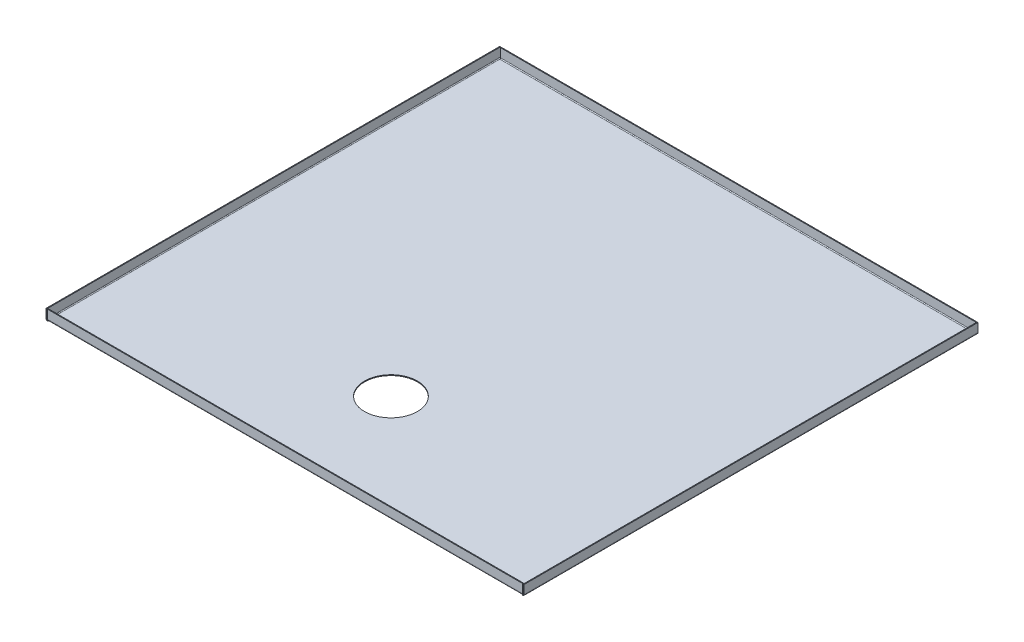
ISO-10303-21;
HEADER;
FILE_DESCRIPTION(('STEP AP214'),'2;1');
FILE_NAME('part.step','',(''),(''),'','','');
FILE_SCHEMA(('AUTOMOTIVE_DESIGN { 1 0 10303 214 1 1 1 1 }'));
ENDSEC;
DATA;
#1=APPLICATION_CONTEXT('core data for automotive mechanical design processes');
#2=APPLICATION_PROTOCOL_DEFINITION('international standard','automotive_design',2000,#1);
#3=PRODUCT_CONTEXT('',#1,'mechanical');
#4=PRODUCT('Part','Part','',(#3));
#5=PRODUCT_RELATED_PRODUCT_CATEGORY('part','',(#4));
#6=PRODUCT_DEFINITION_FORMATION('','',#4);
#7=PRODUCT_DEFINITION_CONTEXT('part definition',#1,'design');
#8=PRODUCT_DEFINITION('design','',#6,#7);
#9=PRODUCT_DEFINITION_SHAPE('','',#8);
#10=(LENGTH_UNIT() NAMED_UNIT(*) SI_UNIT(.MILLI.,.METRE.));
#11=(NAMED_UNIT(*) PLANE_ANGLE_UNIT() SI_UNIT($,.RADIAN.));
#12=(NAMED_UNIT(*) SI_UNIT($,.STERADIAN.) SOLID_ANGLE_UNIT());
#13=UNCERTAINTY_MEASURE_WITH_UNIT(LENGTH_MEASURE(1.E-05),#10,'distance_accuracy_value','');
#14=(GEOMETRIC_REPRESENTATION_CONTEXT(3) GLOBAL_UNCERTAINTY_ASSIGNED_CONTEXT((#13)) GLOBAL_UNIT_ASSIGNED_CONTEXT((#10,
#11,#12)) REPRESENTATION_CONTEXT('',''));
#15=CARTESIAN_POINT('',(0.,0.,0.));
#16=DIRECTION('',(0.,0.,1.));
#17=DIRECTION('',(1.,0.,0.));
#18=AXIS2_PLACEMENT_3D('',#15,#16,#17);
#19=CARTESIAN_POINT('',(4.,2.,0.));
#20=DIRECTION('',(1.,0.,0.));
#21=DIRECTION('',(0.,0.,-1.));
#22=AXIS2_PLACEMENT_3D('',#19,#20,#21);
#23=PLANE('',#22);
#24=DIRECTION('',(0.,0.,1.));
#25=VECTOR('',#24,1.);
#26=CARTESIAN_POINT('',(4.,2.,0.));
#27=LINE('',#26,#25);
#28=CARTESIAN_POINT('',(4.,2.,0.));
#29=VERTEX_POINT('',#28);
#30=CARTESIAN_POINT('',(4.,2.,0.535898384862228));
#31=VERTEX_POINT('',#30);
#32=EDGE_CURVE('E204',#29,#31,#27,.T.);
#33=ORIENTED_EDGE('',*,*,#32,.T.);
#34=CARTESIAN_POINT('',(4.,3.99999999999998,3.99999999999999));
#35=DIRECTION('',(-1.,0.,0.));
#36=DIRECTION('',(0.,0.,1.));
#37=AXIS2_PLACEMENT_3D('',#34,#35,#36);
#38=CIRCLE('',#37,4.);
#39=CARTESIAN_POINT('',(4.,0.,4.));
#40=VERTEX_POINT('',#39);
#41=EDGE_CURVE('E13',#31,#40,#38,.T.);
#42=ORIENTED_EDGE('',*,*,#41,.T.);
#43=DIRECTION('',(0.,0.,-1.));
#44=VECTOR('',#43,1.);
#45=CARTESIAN_POINT('',(4.,0.,1096.));
#46=LINE('',#45,#44);
#47=CARTESIAN_POINT('',(4.,0.,0.));
#48=VERTEX_POINT('',#47);
#49=EDGE_CURVE('E232',#40,#48,#46,.T.);
#50=ORIENTED_EDGE('',*,*,#49,.T.);
#51=DIRECTION('',(0.,1.,0.));
#52=VECTOR('',#51,1.);
#53=CARTESIAN_POINT('',(4.,0.,0.));
#54=LINE('',#53,#52);
#55=EDGE_CURVE('E269',#48,#29,#54,.T.);
#56=ORIENTED_EDGE('',*,*,#55,.T.);
#57=EDGE_LOOP('',(#33,#42,#50,#56));
#58=FACE_BOUND('',#57,.T.);
#59=ADVANCED_FACE('F76',(#58),#23,.T.);
#60=CARTESIAN_POINT('',(1151.,1.99999999999998,3.99999999999999));
#61=DIRECTION('',(-1.,0.,0.));
#62=DIRECTION('',(0.,0.,1.));
#63=AXIS2_PLACEMENT_3D('',#60,#61,#62);
#64=PLANE('',#63);
#65=DIRECTION('',(0.,0.,-1.));
#66=VECTOR('',#65,1.);
#67=CARTESIAN_POINT('',(1151.,0.,1096.));
#68=LINE('',#67,#66);
#69=CARTESIAN_POINT('',(1151.,0.,3.99999999999999));
#70=VERTEX_POINT('',#69);
#71=CARTESIAN_POINT('',(1151.,0.,0.));
#72=VERTEX_POINT('',#71);
#73=EDGE_CURVE('E228',#70,#72,#68,.T.);
#74=ORIENTED_EDGE('',*,*,#73,.F.);
#75=CARTESIAN_POINT('',(1151.,3.99999999999998,3.99999999999999));
#76=DIRECTION('',(-1.,0.,0.));
#77=DIRECTION('',(0.,0.,1.));
#78=AXIS2_PLACEMENT_3D('',#75,#76,#77);
#79=CIRCLE('',#78,4.);
#80=CARTESIAN_POINT('',(1151.,2.,0.535898384862228));
#81=VERTEX_POINT('',#80);
#82=EDGE_CURVE('E401',#70,#81,#79,.F.);
#83=ORIENTED_EDGE('',*,*,#82,.T.);
#84=DIRECTION('',(0.,0.,-1.));
#85=VECTOR('',#84,1.);
#86=CARTESIAN_POINT('',(1151.,1.99999999999998,3.99999999999999));
#87=LINE('',#86,#85);
#88=CARTESIAN_POINT('',(1151.,2.,0.));
#89=VERTEX_POINT('',#88);
#90=EDGE_CURVE('E316',#81,#89,#87,.T.);
#91=ORIENTED_EDGE('',*,*,#90,.T.);
#92=DIRECTION('',(0.,-1.,0.));
#93=VECTOR('',#92,1.);
#94=CARTESIAN_POINT('',(1151.,2.,0.));
#95=LINE('',#94,#93);
#96=EDGE_CURVE('E260',#89,#72,#95,.T.);
#97=ORIENTED_EDGE('',*,*,#96,.T.);
#98=EDGE_LOOP('',(#74,#83,#91,#97));
#99=FACE_BOUND('',#98,.T.);
#100=ADVANCED_FACE('F597',(#99),#64,.T.);
#101=CARTESIAN_POINT('',(1151.,2.,1096.));
#102=DIRECTION('',(-1.,0.,0.));
#103=DIRECTION('',(0.,0.,1.));
#104=AXIS2_PLACEMENT_3D('',#101,#102,#103);
#105=PLANE('',#104);
#106=DIRECTION('',(0.,0.,-1.));
#107=VECTOR('',#106,1.);
#108=CARTESIAN_POINT('',(1151.,2.,1096.));
#109=LINE('',#108,#107);
#110=CARTESIAN_POINT('',(1151.,2.,1096.));
#111=VERTEX_POINT('',#110);
#112=CARTESIAN_POINT('',(1151.,2.,1095.46410161514));
#113=VERTEX_POINT('',#112);
#114=EDGE_CURVE('E249',#111,#113,#109,.T.);
#115=ORIENTED_EDGE('',*,*,#114,.T.);
#116=CARTESIAN_POINT('',(1151.,4.,1092.));
#117=DIRECTION('',(1.,0.,0.));
#118=DIRECTION('',(0.,0.,-1.));
#119=AXIS2_PLACEMENT_3D('',#116,#117,#118);
#120=CIRCLE('',#119,4.);
#121=CARTESIAN_POINT('',(1151.,0.,1092.));
#122=VERTEX_POINT('',#121);
#123=EDGE_CURVE('E85',#113,#122,#120,.T.);
#124=ORIENTED_EDGE('',*,*,#123,.T.);
#125=CARTESIAN_POINT('',(1151.,0.,1096.));
#126=VERTEX_POINT('',#125);
#127=EDGE_CURVE('E229',#126,#122,#68,.T.);
#128=ORIENTED_EDGE('',*,*,#127,.F.);
#129=DIRECTION('',(0.,1.,0.));
#130=VECTOR('',#129,1.);
#131=CARTESIAN_POINT('',(1151.,0.,1096.));
#132=LINE('',#131,#130);
#133=EDGE_CURVE('E264',#126,#111,#132,.T.);
#134=ORIENTED_EDGE('',*,*,#133,.T.);
#135=EDGE_LOOP('',(#115,#124,#128,#134));
#136=FACE_BOUND('',#135,.T.);
#137=ADVANCED_FACE('F602',(#136),#105,.T.);
#138=CARTESIAN_POINT('',(4.,2.,1092.));
#139=DIRECTION('',(1.,0.,0.));
#140=DIRECTION('',(0.,0.,-1.));
#141=AXIS2_PLACEMENT_3D('',#138,#139,#140);
#142=PLANE('',#141);
#143=CARTESIAN_POINT('',(4.,0.,1096.));
#144=VERTEX_POINT('',#143);
#145=CARTESIAN_POINT('',(4.,0.,1092.));
#146=VERTEX_POINT('',#145);
#147=EDGE_CURVE('E234',#144,#146,#46,.T.);
#148=ORIENTED_EDGE('',*,*,#147,.T.);
#149=CARTESIAN_POINT('',(4.,4.,1092.));
#150=DIRECTION('',(1.,0.,0.));
#151=DIRECTION('',(0.,0.,-1.));
#152=AXIS2_PLACEMENT_3D('',#149,#150,#151);
#153=CIRCLE('',#152,4.);
#154=CARTESIAN_POINT('',(4.,2.,1095.46410161514));
#155=VERTEX_POINT('',#154);
#156=EDGE_CURVE('E452',#146,#155,#153,.F.);
#157=ORIENTED_EDGE('',*,*,#156,.T.);
#158=DIRECTION('',(0.,0.,-1.));
#159=VECTOR('',#158,1.);
#160=CARTESIAN_POINT('',(4.,2.,1096.));
#161=LINE('',#160,#159);
#162=CARTESIAN_POINT('',(4.,2.,1096.));
#163=VERTEX_POINT('',#162);
#164=EDGE_CURVE('E244',#163,#155,#161,.T.);
#165=ORIENTED_EDGE('',*,*,#164,.F.);
#166=DIRECTION('',(0.,-1.,0.));
#167=VECTOR('',#166,1.);
#168=CARTESIAN_POINT('',(4.,2.,1096.));
#169=LINE('',#168,#167);
#170=EDGE_CURVE('E272',#163,#144,#169,.T.);
#171=ORIENTED_EDGE('',*,*,#170,.T.);
#172=EDGE_LOOP('',(#148,#157,#165,#171));
#173=FACE_BOUND('',#172,.T.);
#174=ADVANCED_FACE('F380',(#173),#142,.T.);
#175=CARTESIAN_POINT('',(0.,2.,1096.));
#176=DIRECTION('',(0.,1.,0.));
#177=DIRECTION('',(0.,0.,1.));
#178=AXIS2_PLACEMENT_3D('',#175,#176,#177);
#179=PLANE('',#178);
#180=CARTESIAN_POINT('',(577.499999999998,2.,840.335133884615));
#181=DIRECTION('',(0.,1.,0.));
#182=DIRECTION('',(0.,0.,1.));
#183=AXIS2_PLACEMENT_3D('',#180,#181,#182);
#184=CIRCLE('',#183,63.9208880454919);
#185=CARTESIAN_POINT('',(577.499999999998,2.,904.256021930107));
#186=VERTEX_POINT('',#185);
#187=EDGE_CURVE('E573',#186,#186,#184,.T.);
#188=ORIENTED_EDGE('',*,*,#187,.F.);
#189=EDGE_LOOP('',(#188));
#190=FACE_BOUND('',#189,.T.);
#191=CARTESIAN_POINT('',(1151.,2.,1092.));
#192=VERTEX_POINT('',#191);
#193=CARTESIAN_POINT('',(1151.,1.99999999999998,3.99999999999999));
#194=VERTEX_POINT('',#193);
#195=EDGE_CURVE('E247',#192,#194,#109,.T.);
#196=ORIENTED_EDGE('',*,*,#195,.T.);
#197=DIRECTION('',(-1.,0.,0.));
#198=VECTOR('',#197,1.);
#199=CARTESIAN_POINT('',(4.,1.99999999999998,3.99999999999999));
#200=LINE('',#199,#198);
#201=CARTESIAN_POINT('',(4.,1.99999999999998,3.99999999999999));
#202=VERTEX_POINT('',#201);
#203=EDGE_CURVE('E414',#202,#194,#200,.F.);
#204=ORIENTED_EDGE('',*,*,#203,.F.);
#205=CARTESIAN_POINT('',(4.,2.,1092.));
#206=VERTEX_POINT('',#205);
#207=EDGE_CURVE('E243',#206,#202,#161,.T.);
#208=ORIENTED_EDGE('',*,*,#207,.F.);
#209=DIRECTION('',(1.,0.,0.));
#210=VECTOR('',#209,1.);
#211=CARTESIAN_POINT('',(1151.,2.,1092.));
#212=LINE('',#211,#210);
#213=EDGE_CURVE('E299',#192,#206,#212,.F.);
#214=ORIENTED_EDGE('',*,*,#213,.F.);
#215=EDGE_LOOP('',(#196,#204,#208,#214));
#216=FACE_BOUND('',#215,.T.);
#217=ADVANCED_FACE('F609',(#190,#216),#179,.T.);
#218=CARTESIAN_POINT('',(0.,0.,1096.));
#219=DIRECTION('',(0.,1.,0.));
#220=DIRECTION('',(0.,0.,1.));
#221=AXIS2_PLACEMENT_3D('',#218,#219,#220);
#222=PLANE('',#221);
#223=CARTESIAN_POINT('',(577.499999999998,0.,840.335133884615));
#224=DIRECTION('',(0.,1.,0.));
#225=DIRECTION('',(0.,0.,1.));
#226=AXIS2_PLACEMENT_3D('',#223,#224,#225);
#227=CIRCLE('',#226,63.9208880454919);
#228=CARTESIAN_POINT('',(577.499999999998,0.,904.256021930107));
#229=VERTEX_POINT('',#228);
#230=EDGE_CURVE('E80',#229,#229,#227,.T.);
#231=ORIENTED_EDGE('',*,*,#230,.T.);
#232=EDGE_LOOP('',(#231));
#233=FACE_BOUND('',#232,.T.);
#234=DIRECTION('',(-1.,0.,0.));
#235=VECTOR('',#234,1.);
#236=CARTESIAN_POINT('',(4.,0.,3.99999999999999));
#237=LINE('',#236,#235);
#238=EDGE_CURVE('E391',#40,#70,#237,.F.);
#239=ORIENTED_EDGE('',*,*,#238,.T.);
#240=EDGE_CURVE('E233',#122,#70,#68,.T.);
#241=ORIENTED_EDGE('',*,*,#240,.F.);
#242=DIRECTION('',(1.,0.,0.));
#243=VECTOR('',#242,1.);
#244=CARTESIAN_POINT('',(1151.,0.,1092.));
#245=LINE('',#244,#243);
#246=EDGE_CURVE('E287',#122,#146,#245,.F.);
#247=ORIENTED_EDGE('',*,*,#246,.T.);
#248=EDGE_CURVE('E237',#146,#40,#46,.T.);
#249=ORIENTED_EDGE('',*,*,#248,.T.);
#250=EDGE_LOOP('',(#239,#241,#247,#249));
#251=FACE_BOUND('',#250,.T.);
#252=ADVANCED_FACE('F390',(#233,#251),#222,.F.);
#253=CARTESIAN_POINT('',(0.,4.,1096.));
#254=DIRECTION('',(0.,0.,1.));
#255=DIRECTION('',(1.,0.,0.));
#256=AXIS2_PLACEMENT_3D('',#253,#254,#255);
#257=PLANE('',#256);
#258=DIRECTION('',(1.,0.,0.));
#259=VECTOR('',#258,1.);
#260=CARTESIAN_POINT('',(0.,4.,1096.));
#261=LINE('',#260,#259);
#262=CARTESIAN_POINT('',(0.,4.,1096.));
#263=VERTEX_POINT('',#262);
#264=CARTESIAN_POINT('',(2.,4.,1096.));
#265=VERTEX_POINT('',#264);
#266=EDGE_CURVE('E274',#263,#265,#261,.T.);
#267=ORIENTED_EDGE('',*,*,#266,.F.);
#268=CARTESIAN_POINT('',(4.,4.,1096.));
#269=DIRECTION('',(0.,0.,-1.));
#270=DIRECTION('',(-1.,0.,0.));
#271=AXIS2_PLACEMENT_3D('',#268,#269,#270);
#272=CIRCLE('',#271,4.);
#273=EDGE_CURVE('E184',#263,#144,#272,.F.);
#274=ORIENTED_EDGE('',*,*,#273,.T.);
#275=ORIENTED_EDGE('',*,*,#170,.F.);
#276=CARTESIAN_POINT('',(4.,4.,1096.));
#277=DIRECTION('',(0.,0.,1.));
#278=DIRECTION('',(1.,0.,0.));
#279=AXIS2_PLACEMENT_3D('',#276,#277,#278);
#280=CIRCLE('',#279,2.);
#281=EDGE_CURVE('E191',#265,#163,#280,.T.);
#282=ORIENTED_EDGE('',*,*,#281,.F.);
#283=EDGE_LOOP('',(#267,#274,#275,#282));
#284=FACE_BOUND('',#283,.T.);
#285=ADVANCED_FACE('F78',(#284),#257,.T.);
#286=CARTESIAN_POINT('',(4.,2.,1096.));
#287=DIRECTION('',(0.,0.,1.));
#288=DIRECTION('',(1.,0.,0.));
#289=AXIS2_PLACEMENT_3D('',#286,#287,#288);
#290=PLANE('',#289);
#291=DIRECTION('',(0.,-1.,0.));
#292=VECTOR('',#291,1.);
#293=CARTESIAN_POINT('',(0.,25.,1096.));
#294=LINE('',#293,#292);
#295=CARTESIAN_POINT('',(0.,25.,1096.));
#296=VERTEX_POINT('',#295);
#297=EDGE_CURVE('E179',#296,#263,#294,.T.);
#298=ORIENTED_EDGE('',*,*,#297,.T.);
#299=ORIENTED_EDGE('',*,*,#266,.T.);
#300=DIRECTION('',(0.,-1.,0.));
#301=VECTOR('',#300,1.);
#302=CARTESIAN_POINT('',(2.00000000000001,25.,1096.));
#303=LINE('',#302,#301);
#304=CARTESIAN_POINT('',(2.00000000000001,25.,1096.));
#305=VERTEX_POINT('',#304);
#306=EDGE_CURVE('E189',#305,#265,#303,.T.);
#307=ORIENTED_EDGE('',*,*,#306,.F.);
#308=DIRECTION('',(1.,0.,0.));
#309=VECTOR('',#308,1.);
#310=CARTESIAN_POINT('',(0.,25.,1096.));
#311=LINE('',#310,#309);
#312=EDGE_CURVE('E168',#296,#305,#311,.T.);
#313=ORIENTED_EDGE('',*,*,#312,.F.);
#314=EDGE_LOOP('',(#298,#299,#307,#313));
#315=FACE_BOUND('',#314,.T.);
#316=ADVANCED_FACE('F187',(#315),#290,.T.);
#317=CARTESIAN_POINT('',(4.,0.,0.));
#318=DIRECTION('',(0.,0.,-1.));
#319=DIRECTION('',(-1.,0.,0.));
#320=AXIS2_PLACEMENT_3D('',#317,#318,#319);
#321=PLANE('',#320);
#322=ORIENTED_EDGE('',*,*,#55,.F.);
#323=CARTESIAN_POINT('',(4.,4.,0.));
#324=DIRECTION('',(0.,0.,-1.));
#325=DIRECTION('',(-1.,0.,0.));
#326=AXIS2_PLACEMENT_3D('',#323,#324,#325);
#327=CIRCLE('',#326,4.);
#328=CARTESIAN_POINT('',(0.,4.,0.));
#329=VERTEX_POINT('',#328);
#330=EDGE_CURVE('E221',#329,#48,#327,.F.);
#331=ORIENTED_EDGE('',*,*,#330,.F.);
#332=DIRECTION('',(-1.,0.,0.));
#333=VECTOR('',#332,1.);
#334=CARTESIAN_POINT('',(2.,4.,0.));
#335=LINE('',#334,#333);
#336=CARTESIAN_POINT('',(2.,4.,0.));
#337=VERTEX_POINT('',#336);
#338=EDGE_CURVE('E267',#337,#329,#335,.T.);
#339=ORIENTED_EDGE('',*,*,#338,.F.);
#340=CARTESIAN_POINT('',(4.,4.,0.));
#341=DIRECTION('',(0.,0.,1.));
#342=DIRECTION('',(1.,0.,0.));
#343=AXIS2_PLACEMENT_3D('',#340,#341,#342);
#344=CIRCLE('',#343,2.);
#345=EDGE_CURVE('E212',#337,#29,#344,.T.);
#346=ORIENTED_EDGE('',*,*,#345,.T.);
#347=EDGE_LOOP('',(#322,#331,#339,#346));
#348=FACE_BOUND('',#347,.T.);
#349=ADVANCED_FACE('F352',(#348),#321,.T.);
#350=CARTESIAN_POINT('',(1151.,0.,1096.));
#351=DIRECTION('',(0.,0.,1.));
#352=DIRECTION('',(1.,0.,0.));
#353=AXIS2_PLACEMENT_3D('',#350,#351,#352);
#354=PLANE('',#353);
#355=ORIENTED_EDGE('',*,*,#133,.F.);
#356=CARTESIAN_POINT('',(1151.,4.,1096.));
#357=DIRECTION('',(0.,0.,-1.));
#358=DIRECTION('',(-1.,0.,0.));
#359=AXIS2_PLACEMENT_3D('',#356,#357,#358);
#360=CIRCLE('',#359,4.);
#361=CARTESIAN_POINT('',(1155.,4.,1096.));
#362=VERTEX_POINT('',#361);
#363=EDGE_CURVE('E197',#126,#362,#360,.F.);
#364=ORIENTED_EDGE('',*,*,#363,.T.);
#365=DIRECTION('',(1.,0.,0.));
#366=VECTOR('',#365,1.);
#367=CARTESIAN_POINT('',(1153.,4.,1096.));
#368=LINE('',#367,#366);
#369=CARTESIAN_POINT('',(1153.,4.,1096.));
#370=VERTEX_POINT('',#369);
#371=EDGE_CURVE('E103',#370,#362,#368,.T.);
#372=ORIENTED_EDGE('',*,*,#371,.F.);
#373=CARTESIAN_POINT('',(1151.,4.,1096.));
#374=DIRECTION('',(0.,0.,1.));
#375=DIRECTION('',(1.,0.,0.));
#376=AXIS2_PLACEMENT_3D('',#373,#374,#375);
#377=CIRCLE('',#376,2.);
#378=EDGE_CURVE('E324',#111,#370,#377,.T.);
#379=ORIENTED_EDGE('',*,*,#378,.F.);
#380=EDGE_LOOP('',(#355,#364,#372,#379));
#381=FACE_BOUND('',#380,.T.);
#382=ADVANCED_FACE('F659',(#381),#354,.T.);
#383=CARTESIAN_POINT('',(1155.,4.,0.));
#384=DIRECTION('',(0.,0.,-1.));
#385=DIRECTION('',(-1.,0.,0.));
#386=AXIS2_PLACEMENT_3D('',#383,#384,#385);
#387=PLANE('',#386);
#388=DIRECTION('',(-1.,0.,0.));
#389=VECTOR('',#388,1.);
#390=CARTESIAN_POINT('',(1155.,4.,0.));
#391=LINE('',#390,#389);
#392=CARTESIAN_POINT('',(1155.,4.,0.));
#393=VERTEX_POINT('',#392);
#394=CARTESIAN_POINT('',(1153.,4.,0.));
#395=VERTEX_POINT('',#394);
#396=EDGE_CURVE('E140',#393,#395,#391,.T.);
#397=ORIENTED_EDGE('',*,*,#396,.F.);
#398=CARTESIAN_POINT('',(1151.,4.,0.));
#399=DIRECTION('',(0.,0.,-1.));
#400=DIRECTION('',(-1.,0.,0.));
#401=AXIS2_PLACEMENT_3D('',#398,#399,#400);
#402=CIRCLE('',#401,4.);
#403=EDGE_CURVE('E224',#72,#393,#402,.F.);
#404=ORIENTED_EDGE('',*,*,#403,.F.);
#405=ORIENTED_EDGE('',*,*,#96,.F.);
#406=CARTESIAN_POINT('',(1151.,4.,0.));
#407=DIRECTION('',(0.,0.,1.));
#408=DIRECTION('',(1.,0.,0.));
#409=AXIS2_PLACEMENT_3D('',#406,#407,#408);
#410=CIRCLE('',#409,2.);
#411=EDGE_CURVE('E210',#89,#395,#410,.T.);
#412=ORIENTED_EDGE('',*,*,#411,.T.);
#413=EDGE_LOOP('',(#397,#404,#405,#412));
#414=FACE_BOUND('',#413,.T.);
#415=ADVANCED_FACE('F655',(#414),#387,.T.);
#416=CARTESIAN_POINT('',(1151.,2.,0.));
#417=DIRECTION('',(0.,0.,-1.));
#418=DIRECTION('',(-1.,0.,0.));
#419=AXIS2_PLACEMENT_3D('',#416,#417,#418);
#420=PLANE('',#419);
#421=DIRECTION('',(0.,1.,0.));
#422=VECTOR('',#421,1.);
#423=CARTESIAN_POINT('',(1155.,0.,0.));
#424=LINE('',#423,#422);
#425=CARTESIAN_POINT('',(1155.,25.,0.));
#426=VERTEX_POINT('',#425);
#427=EDGE_CURVE('E200',#393,#426,#424,.T.);
#428=ORIENTED_EDGE('',*,*,#427,.F.);
#429=ORIENTED_EDGE('',*,*,#396,.T.);
#430=DIRECTION('',(0.,1.,0.));
#431=VECTOR('',#430,1.);
#432=CARTESIAN_POINT('',(1153.,0.,0.));
#433=LINE('',#432,#431);
#434=CARTESIAN_POINT('',(1153.,25.,0.));
#435=VERTEX_POINT('',#434);
#436=EDGE_CURVE('E207',#395,#435,#433,.T.);
#437=ORIENTED_EDGE('',*,*,#436,.T.);
#438=DIRECTION('',(1.,0.,0.));
#439=VECTOR('',#438,1.);
#440=CARTESIAN_POINT('',(1153.,25.,0.));
#441=LINE('',#440,#439);
#442=EDGE_CURVE('E203',#435,#426,#441,.T.);
#443=ORIENTED_EDGE('',*,*,#442,.T.);
#444=EDGE_LOOP('',(#428,#429,#437,#443));
#445=FACE_BOUND('',#444,.T.);
#446=ADVANCED_FACE('F651',(#445),#420,.T.);
#447=CARTESIAN_POINT('',(1155.,0.,1096.));
#448=DIRECTION('',(-1.,0.,0.));
#449=DIRECTION('',(0.,0.,1.));
#450=AXIS2_PLACEMENT_3D('',#447,#448,#449);
#451=PLANE('',#450);
#452=ORIENTED_EDGE('',*,*,#427,.T.);
#453=DIRECTION('',(0.,0.,-1.));
#454=VECTOR('',#453,1.);
#455=CARTESIAN_POINT('',(1155.,25.,1096.));
#456=LINE('',#455,#454);
#457=CARTESIAN_POINT('',(1155.,25.,1096.));
#458=VERTEX_POINT('',#457);
#459=EDGE_CURVE('E258',#458,#426,#456,.T.);
#460=ORIENTED_EDGE('',*,*,#459,.F.);
#461=DIRECTION('',(0.,1.,0.));
#462=VECTOR('',#461,1.);
#463=CARTESIAN_POINT('',(1155.,0.,1096.));
#464=LINE('',#463,#462);
#465=EDGE_CURVE('E146',#362,#458,#464,.T.);
#466=ORIENTED_EDGE('',*,*,#465,.F.);
#467=DIRECTION('',(0.,0.,-1.));
#468=VECTOR('',#467,1.);
#469=CARTESIAN_POINT('',(1155.,4.,1096.));
#470=LINE('',#469,#468);
#471=EDGE_CURVE('E199',#362,#393,#470,.T.);
#472=ORIENTED_EDGE('',*,*,#471,.T.);
#473=EDGE_LOOP('',(#452,#460,#466,#472));
#474=FACE_BOUND('',#473,.T.);
#475=ADVANCED_FACE('F647',(#474),#451,.F.);
#476=CARTESIAN_POINT('',(1153.,25.,1096.));
#477=DIRECTION('',(0.,1.,0.));
#478=DIRECTION('',(0.,0.,1.));
#479=AXIS2_PLACEMENT_3D('',#476,#477,#478);
#480=PLANE('',#479);
#481=ORIENTED_EDGE('',*,*,#442,.F.);
#482=DIRECTION('',(0.,0.,-1.));
#483=VECTOR('',#482,1.);
#484=CARTESIAN_POINT('',(1153.,25.,1096.));
#485=LINE('',#484,#483);
#486=CARTESIAN_POINT('',(1153.,25.,1096.));
#487=VERTEX_POINT('',#486);
#488=EDGE_CURVE('E256',#487,#435,#485,.T.);
#489=ORIENTED_EDGE('',*,*,#488,.F.);
#490=DIRECTION('',(1.,0.,0.));
#491=VECTOR('',#490,1.);
#492=CARTESIAN_POINT('',(1153.,25.,1096.));
#493=LINE('',#492,#491);
#494=EDGE_CURVE('E318',#487,#458,#493,.T.);
#495=ORIENTED_EDGE('',*,*,#494,.T.);
#496=ORIENTED_EDGE('',*,*,#459,.T.);
#497=EDGE_LOOP('',(#481,#489,#495,#496));
#498=FACE_BOUND('',#497,.T.);
#499=ADVANCED_FACE('F643',(#498),#480,.T.);
#500=CARTESIAN_POINT('',(1153.,0.,1096.));
#501=DIRECTION('',(-1.,0.,0.));
#502=DIRECTION('',(0.,0.,1.));
#503=AXIS2_PLACEMENT_3D('',#500,#501,#502);
#504=PLANE('',#503);
#505=ORIENTED_EDGE('',*,*,#436,.F.);
#506=DIRECTION('',(0.,0.,-1.));
#507=VECTOR('',#506,1.);
#508=CARTESIAN_POINT('',(1153.,4.,1096.));
#509=LINE('',#508,#507);
#510=EDGE_CURVE('E252',#370,#395,#509,.T.);
#511=ORIENTED_EDGE('',*,*,#510,.F.);
#512=DIRECTION('',(0.,1.,0.));
#513=VECTOR('',#512,1.);
#514=CARTESIAN_POINT('',(1153.,0.,1096.));
#515=LINE('',#514,#513);
#516=EDGE_CURVE('E321',#370,#487,#515,.T.);
#517=ORIENTED_EDGE('',*,*,#516,.T.);
#518=ORIENTED_EDGE('',*,*,#488,.T.);
#519=EDGE_LOOP('',(#505,#511,#517,#518));
#520=FACE_BOUND('',#519,.T.);
#521=ADVANCED_FACE('F639',(#520),#504,.T.);
#522=CARTESIAN_POINT('',(1151.,4.,1096.));
#523=DIRECTION('',(0.,0.,-1.));
#524=DIRECTION('',(-1.,0.,0.));
#525=AXIS2_PLACEMENT_3D('',#522,#523,#524);
#526=CYLINDRICAL_SURFACE('',#525,2.);
#527=ORIENTED_EDGE('',*,*,#411,.F.);
#528=ORIENTED_EDGE('',*,*,#90,.F.);
#529=EDGE_CURVE('E313',#194,#81,#87,.T.);
#530=ORIENTED_EDGE('',*,*,#529,.F.);
#531=ORIENTED_EDGE('',*,*,#195,.F.);
#532=EDGE_CURVE('E253',#113,#192,#109,.T.);
#533=ORIENTED_EDGE('',*,*,#532,.F.);
#534=ORIENTED_EDGE('',*,*,#114,.F.);
#535=ORIENTED_EDGE('',*,*,#378,.T.);
#536=ORIENTED_EDGE('',*,*,#510,.T.);
#537=EDGE_LOOP('',(#527,#528,#530,#531,#533,#534,#535,#536));
#538=FACE_BOUND('',#537,.T.);
#539=ADVANCED_FACE('F633',(#538),#526,.F.);
#540=CARTESIAN_POINT('',(4.,4.,1096.));
#541=DIRECTION('',(0.,0.,-1.));
#542=DIRECTION('',(-1.,0.,0.));
#543=AXIS2_PLACEMENT_3D('',#540,#541,#542);
#544=CYLINDRICAL_SURFACE('',#543,2.);
#545=ORIENTED_EDGE('',*,*,#345,.F.);
#546=DIRECTION('',(0.,0.,-1.));
#547=VECTOR('',#546,1.);
#548=CARTESIAN_POINT('',(2.,4.,1096.));
#549=LINE('',#548,#547);
#550=EDGE_CURVE('E240',#265,#337,#549,.T.);
#551=ORIENTED_EDGE('',*,*,#550,.F.);
#552=ORIENTED_EDGE('',*,*,#281,.T.);
#553=ORIENTED_EDGE('',*,*,#164,.T.);
#554=EDGE_CURVE('E248',#155,#206,#161,.T.);
#555=ORIENTED_EDGE('',*,*,#554,.T.);
#556=ORIENTED_EDGE('',*,*,#207,.T.);
#557=EDGE_CURVE('E94',#31,#202,#27,.T.);
#558=ORIENTED_EDGE('',*,*,#557,.F.);
#559=ORIENTED_EDGE('',*,*,#32,.F.);
#560=EDGE_LOOP('',(#545,#551,#552,#553,#555,#556,#558,#559));
#561=FACE_BOUND('',#560,.T.);
#562=ADVANCED_FACE('F330',(#561),#544,.F.);
#563=CARTESIAN_POINT('',(2.00000000000001,25.,1096.));
#564=DIRECTION('',(1.,0.,0.));
#565=DIRECTION('',(0.,1.,0.));
#566=AXIS2_PLACEMENT_3D('',#563,#564,#565);
#567=PLANE('',#566);
#568=DIRECTION('',(0.,-1.,0.));
#569=VECTOR('',#568,1.);
#570=CARTESIAN_POINT('',(2.00000000000001,25.,0.));
#571=LINE('',#570,#569);
#572=CARTESIAN_POINT('',(2.00000000000001,25.,0.));
#573=VERTEX_POINT('',#572);
#574=EDGE_CURVE('E215',#573,#337,#571,.T.);
#575=ORIENTED_EDGE('',*,*,#574,.F.);
#576=DIRECTION('',(0.,0.,-1.));
#577=VECTOR('',#576,1.);
#578=CARTESIAN_POINT('',(2.00000000000001,25.,1096.));
#579=LINE('',#578,#577);
#580=EDGE_CURVE('E174',#305,#573,#579,.T.);
#581=ORIENTED_EDGE('',*,*,#580,.F.);
#582=ORIENTED_EDGE('',*,*,#306,.T.);
#583=ORIENTED_EDGE('',*,*,#550,.T.);
#584=EDGE_LOOP('',(#575,#581,#582,#583));
#585=FACE_BOUND('',#584,.T.);
#586=ADVANCED_FACE('F341',(#585),#567,.T.);
#587=CARTESIAN_POINT('',(0.,25.,1096.));
#588=DIRECTION('',(0.,1.,0.));
#589=DIRECTION('',(0.,0.,1.));
#590=AXIS2_PLACEMENT_3D('',#587,#588,#589);
#591=PLANE('',#590);
#592=DIRECTION('',(1.,0.,0.));
#593=VECTOR('',#592,1.);
#594=CARTESIAN_POINT('',(0.,25.,0.));
#595=LINE('',#594,#593);
#596=CARTESIAN_POINT('',(0.,25.,0.));
#597=VERTEX_POINT('',#596);
#598=EDGE_CURVE('E170',#597,#573,#595,.T.);
#599=ORIENTED_EDGE('',*,*,#598,.F.);
#600=DIRECTION('',(0.,0.,-1.));
#601=VECTOR('',#600,1.);
#602=CARTESIAN_POINT('',(0.,25.,1096.));
#603=LINE('',#602,#601);
#604=EDGE_CURVE('E164',#296,#597,#603,.T.);
#605=ORIENTED_EDGE('',*,*,#604,.F.);
#606=ORIENTED_EDGE('',*,*,#312,.T.);
#607=ORIENTED_EDGE('',*,*,#580,.T.);
#608=EDGE_LOOP('',(#599,#605,#606,#607));
#609=FACE_BOUND('',#608,.T.);
#610=ADVANCED_FACE('F166',(#609),#591,.T.);
#611=CARTESIAN_POINT('',(0.,25.,1096.));
#612=DIRECTION('',(1.,0.,0.));
#613=DIRECTION('',(0.,1.,0.));
#614=AXIS2_PLACEMENT_3D('',#611,#612,#613);
#615=PLANE('',#614);
#616=DIRECTION('',(0.,-1.,0.));
#617=VECTOR('',#616,1.);
#618=CARTESIAN_POINT('',(0.,25.,0.));
#619=LINE('',#618,#617);
#620=EDGE_CURVE('E219',#597,#329,#619,.T.);
#621=ORIENTED_EDGE('',*,*,#620,.T.);
#622=DIRECTION('',(0.,0.,-1.));
#623=VECTOR('',#622,1.);
#624=CARTESIAN_POINT('',(0.,4.,1096.));
#625=LINE('',#624,#623);
#626=EDGE_CURVE('E175',#263,#329,#625,.T.);
#627=ORIENTED_EDGE('',*,*,#626,.F.);
#628=ORIENTED_EDGE('',*,*,#297,.F.);
#629=ORIENTED_EDGE('',*,*,#604,.T.);
#630=EDGE_LOOP('',(#621,#627,#628,#629));
#631=FACE_BOUND('',#630,.T.);
#632=ADVANCED_FACE('F180',(#631),#615,.F.);
#633=CARTESIAN_POINT('',(4.,4.,1096.));
#634=DIRECTION('',(0.,0.,-1.));
#635=DIRECTION('',(-1.,0.,0.));
#636=AXIS2_PLACEMENT_3D('',#633,#634,#635);
#637=CYLINDRICAL_SURFACE('',#636,4.);
#638=ORIENTED_EDGE('',*,*,#330,.T.);
#639=ORIENTED_EDGE('',*,*,#49,.F.);
#640=ORIENTED_EDGE('',*,*,#248,.F.);
#641=ORIENTED_EDGE('',*,*,#147,.F.);
#642=ORIENTED_EDGE('',*,*,#273,.F.);
#643=ORIENTED_EDGE('',*,*,#626,.T.);
#644=EDGE_LOOP('',(#638,#639,#640,#641,#642,#643));
#645=FACE_BOUND('',#644,.T.);
#646=ADVANCED_FACE('F346',(#645),#637,.T.);
#647=CARTESIAN_POINT('',(1151.,4.,1096.));
#648=DIRECTION('',(0.,0.,-1.));
#649=DIRECTION('',(-1.,0.,0.));
#650=AXIS2_PLACEMENT_3D('',#647,#648,#649);
#651=CYLINDRICAL_SURFACE('',#650,4.);
#652=ORIENTED_EDGE('',*,*,#403,.T.);
#653=ORIENTED_EDGE('',*,*,#471,.F.);
#654=ORIENTED_EDGE('',*,*,#363,.F.);
#655=ORIENTED_EDGE('',*,*,#127,.T.);
#656=ORIENTED_EDGE('',*,*,#240,.T.);
#657=ORIENTED_EDGE('',*,*,#73,.T.);
#658=EDGE_LOOP('',(#652,#653,#654,#655,#656,#657));
#659=FACE_BOUND('',#658,.T.);
#660=ADVANCED_FACE('F615',(#659),#651,.T.);
#661=CARTESIAN_POINT('',(1151.,4.,1096.));
#662=DIRECTION('',(0.,0.,1.));
#663=DIRECTION('',(1.,0.,0.));
#664=AXIS2_PLACEMENT_3D('',#661,#662,#663);
#665=PLANE('',#664);
#666=ORIENTED_EDGE('',*,*,#465,.T.);
#667=ORIENTED_EDGE('',*,*,#494,.F.);
#668=ORIENTED_EDGE('',*,*,#516,.F.);
#669=ORIENTED_EDGE('',*,*,#371,.T.);
#670=EDGE_LOOP('',(#666,#667,#668,#669));
#671=FACE_BOUND('',#670,.T.);
#672=ADVANCED_FACE('F612',(#671),#665,.T.);
#673=CARTESIAN_POINT('',(1151.,4.,0.));
#674=DIRECTION('',(0.,0.,1.));
#675=DIRECTION('',(1.,0.,0.));
#676=AXIS2_PLACEMENT_3D('',#673,#674,#675);
#677=PLANE('',#676);
#678=ORIENTED_EDGE('',*,*,#574,.T.);
#679=ORIENTED_EDGE('',*,*,#338,.T.);
#680=ORIENTED_EDGE('',*,*,#620,.F.);
#681=ORIENTED_EDGE('',*,*,#598,.T.);
#682=EDGE_LOOP('',(#678,#679,#680,#681));
#683=FACE_BOUND('',#682,.T.);
#684=ADVANCED_FACE('F343',(#683),#677,.F.);
#685=CARTESIAN_POINT('',(4.,4.,1092.));
#686=DIRECTION('',(-1.,0.,0.));
#687=DIRECTION('',(0.,0.,1.));
#688=AXIS2_PLACEMENT_3D('',#685,#686,#687);
#689=PLANE('',#688);
#690=ORIENTED_EDGE('',*,*,#554,.F.);
#691=CARTESIAN_POINT('',(4.,4.,1096.));
#692=VERTEX_POINT('',#691);
#693=EDGE_CURVE('E296',#155,#692,#153,.F.);
#694=ORIENTED_EDGE('',*,*,#693,.T.);
#695=DIRECTION('',(0.,0.,-1.));
#696=VECTOR('',#695,1.);
#697=CARTESIAN_POINT('',(4.,4.,1096.));
#698=LINE('',#697,#696);
#699=CARTESIAN_POINT('',(4.,4.,1094.));
#700=VERTEX_POINT('',#699);
#701=EDGE_CURVE('E410',#700,#692,#698,.F.);
#702=ORIENTED_EDGE('',*,*,#701,.F.);
#703=CARTESIAN_POINT('',(4.,4.,1092.));
#704=DIRECTION('',(1.,0.,0.));
#705=DIRECTION('',(0.,0.,-1.));
#706=AXIS2_PLACEMENT_3D('',#703,#704,#705);
#707=CIRCLE('',#706,2.);
#708=EDGE_CURVE('E288',#206,#700,#707,.F.);
#709=ORIENTED_EDGE('',*,*,#708,.F.);
#710=EDGE_LOOP('',(#690,#694,#702,#709));
#711=FACE_BOUND('',#710,.T.);
#712=ADVANCED_FACE('F459',(#711),#689,.T.);
#713=CARTESIAN_POINT('',(1151.,4.,1092.));
#714=DIRECTION('',(-1.,0.,0.));
#715=DIRECTION('',(0.,0.,1.));
#716=AXIS2_PLACEMENT_3D('',#713,#714,#715);
#717=PLANE('',#716);
#718=CARTESIAN_POINT('',(1151.,4.,1096.));
#719=VERTEX_POINT('',#718);
#720=EDGE_CURVE('E278',#719,#113,#120,.T.);
#721=ORIENTED_EDGE('',*,*,#720,.T.);
#722=ORIENTED_EDGE('',*,*,#532,.T.);
#723=CARTESIAN_POINT('',(1151.,4.,1092.));
#724=DIRECTION('',(1.,0.,0.));
#725=DIRECTION('',(0.,0.,-1.));
#726=AXIS2_PLACEMENT_3D('',#723,#724,#725);
#727=CIRCLE('',#726,2.);
#728=CARTESIAN_POINT('',(1151.,4.,1094.));
#729=VERTEX_POINT('',#728);
#730=EDGE_CURVE('E306',#729,#192,#727,.T.);
#731=ORIENTED_EDGE('',*,*,#730,.F.);
#732=DIRECTION('',(0.,0.,-1.));
#733=VECTOR('',#732,1.);
#734=CARTESIAN_POINT('',(1151.,4.,1094.));
#735=LINE('',#734,#733);
#736=EDGE_CURVE('E447',#729,#719,#735,.F.);
#737=ORIENTED_EDGE('',*,*,#736,.T.);
#738=EDGE_LOOP('',(#721,#722,#731,#737));
#739=FACE_BOUND('',#738,.T.);
#740=ADVANCED_FACE('F495',(#739),#717,.F.);
#741=CARTESIAN_POINT('',(1151.,4.,1092.));
#742=DIRECTION('',(1.,0.,0.));
#743=DIRECTION('',(0.,0.,1.));
#744=AXIS2_PLACEMENT_3D('',#741,#742,#743);
#745=CYLINDRICAL_SURFACE('',#744,4.);
#746=ORIENTED_EDGE('',*,*,#246,.F.);
#747=ORIENTED_EDGE('',*,*,#123,.F.);
#748=ORIENTED_EDGE('',*,*,#720,.F.);
#749=DIRECTION('',(1.,0.,0.));
#750=VECTOR('',#749,1.);
#751=CARTESIAN_POINT('',(4.,4.,1096.));
#752=LINE('',#751,#750);
#753=EDGE_CURVE('E444',#719,#692,#752,.F.);
#754=ORIENTED_EDGE('',*,*,#753,.T.);
#755=ORIENTED_EDGE('',*,*,#693,.F.);
#756=ORIENTED_EDGE('',*,*,#156,.F.);
#757=EDGE_LOOP('',(#746,#747,#748,#754,#755,#756));
#758=FACE_BOUND('',#757,.T.);
#759=ADVANCED_FACE('F464',(#758),#745,.T.);
#760=CARTESIAN_POINT('',(1151.,4.,1092.));
#761=DIRECTION('',(1.,0.,0.));
#762=DIRECTION('',(0.,0.,1.));
#763=AXIS2_PLACEMENT_3D('',#760,#761,#762);
#764=CYLINDRICAL_SURFACE('',#763,2.);
#765=ORIENTED_EDGE('',*,*,#213,.T.);
#766=ORIENTED_EDGE('',*,*,#708,.T.);
#767=DIRECTION('',(1.,0.,0.));
#768=VECTOR('',#767,1.);
#769=CARTESIAN_POINT('',(4.,4.,1094.));
#770=LINE('',#769,#768);
#771=EDGE_CURVE('E449',#700,#729,#770,.T.);
#772=ORIENTED_EDGE('',*,*,#771,.T.);
#773=ORIENTED_EDGE('',*,*,#730,.T.);
#774=EDGE_LOOP('',(#765,#766,#772,#773));
#775=FACE_BOUND('',#774,.T.);
#776=ADVANCED_FACE('F491',(#775),#764,.F.);
#777=CARTESIAN_POINT('',(4.,2.,1096.));
#778=DIRECTION('',(1.,0.,0.));
#779=DIRECTION('',(0.,0.,-1.));
#780=AXIS2_PLACEMENT_3D('',#777,#778,#779);
#781=PLANE('',#780);
#782=ORIENTED_EDGE('',*,*,#701,.T.);
#783=DIRECTION('',(0.,-1.,0.));
#784=VECTOR('',#783,1.);
#785=CARTESIAN_POINT('',(4.,0.,1096.));
#786=LINE('',#785,#784);
#787=CARTESIAN_POINT('',(4.,25.,1096.));
#788=VERTEX_POINT('',#787);
#789=EDGE_CURVE('E432',#788,#692,#786,.T.);
#790=ORIENTED_EDGE('',*,*,#789,.F.);
#791=DIRECTION('',(0.,0.,-1.));
#792=VECTOR('',#791,1.);
#793=CARTESIAN_POINT('',(4.,25.,1096.));
#794=LINE('',#793,#792);
#795=CARTESIAN_POINT('',(4.,25.,1094.));
#796=VERTEX_POINT('',#795);
#797=EDGE_CURVE('E423',#788,#796,#794,.T.);
#798=ORIENTED_EDGE('',*,*,#797,.T.);
#799=DIRECTION('',(0.,1.,0.));
#800=VECTOR('',#799,1.);
#801=CARTESIAN_POINT('',(4.,2.,1094.));
#802=LINE('',#801,#800);
#803=EDGE_CURVE('E441',#796,#700,#802,.F.);
#804=ORIENTED_EDGE('',*,*,#803,.T.);
#805=EDGE_LOOP('',(#782,#790,#798,#804));
#806=FACE_BOUND('',#805,.T.);
#807=ADVANCED_FACE('F470',(#806),#781,.F.);
#808=CARTESIAN_POINT('',(1151.,25.,1096.));
#809=DIRECTION('',(-1.,0.,0.));
#810=DIRECTION('',(0.,0.,1.));
#811=AXIS2_PLACEMENT_3D('',#808,#809,#810);
#812=PLANE('',#811);
#813=ORIENTED_EDGE('',*,*,#736,.F.);
#814=DIRECTION('',(0.,-1.,0.));
#815=VECTOR('',#814,1.);
#816=CARTESIAN_POINT('',(1151.,25.,1094.));
#817=LINE('',#816,#815);
#818=CARTESIAN_POINT('',(1151.,25.,1094.));
#819=VERTEX_POINT('',#818);
#820=EDGE_CURVE('E438',#729,#819,#817,.F.);
#821=ORIENTED_EDGE('',*,*,#820,.T.);
#822=DIRECTION('',(0.,0.,-1.));
#823=VECTOR('',#822,1.);
#824=CARTESIAN_POINT('',(1151.,25.,1096.));
#825=LINE('',#824,#823);
#826=CARTESIAN_POINT('',(1151.,25.,1096.));
#827=VERTEX_POINT('',#826);
#828=EDGE_CURVE('E311',#827,#819,#825,.T.);
#829=ORIENTED_EDGE('',*,*,#828,.F.);
#830=DIRECTION('',(0.,1.,0.));
#831=VECTOR('',#830,1.);
#832=CARTESIAN_POINT('',(1151.,0.,1096.));
#833=LINE('',#832,#831);
#834=EDGE_CURVE('E429',#719,#827,#833,.T.);
#835=ORIENTED_EDGE('',*,*,#834,.F.);
#836=EDGE_LOOP('',(#813,#821,#829,#835));
#837=FACE_BOUND('',#836,.T.);
#838=ADVANCED_FACE('F497',(#837),#812,.F.);
#839=CARTESIAN_POINT('',(0.,0.,1096.));
#840=DIRECTION('',(0.,0.,-1.));
#841=DIRECTION('',(-1.,0.,0.));
#842=AXIS2_PLACEMENT_3D('',#839,#840,#841);
#843=PLANE('',#842);
#844=ORIENTED_EDGE('',*,*,#753,.F.);
#845=ORIENTED_EDGE('',*,*,#834,.T.);
#846=DIRECTION('',(-1.,0.,0.));
#847=VECTOR('',#846,1.);
#848=CARTESIAN_POINT('',(0.,25.,1096.));
#849=LINE('',#848,#847);
#850=EDGE_CURVE('E426',#827,#788,#849,.T.);
#851=ORIENTED_EDGE('',*,*,#850,.T.);
#852=ORIENTED_EDGE('',*,*,#789,.T.);
#853=EDGE_LOOP('',(#844,#845,#851,#852));
#854=FACE_BOUND('',#853,.T.);
#855=ADVANCED_FACE('F473',(#854),#843,.F.);
#856=CARTESIAN_POINT('',(0.,0.,1094.));
#857=DIRECTION('',(0.,0.,-1.));
#858=DIRECTION('',(-1.,0.,0.));
#859=AXIS2_PLACEMENT_3D('',#856,#857,#858);
#860=PLANE('',#859);
#861=ORIENTED_EDGE('',*,*,#820,.F.);
#862=ORIENTED_EDGE('',*,*,#771,.F.);
#863=ORIENTED_EDGE('',*,*,#803,.F.);
#864=DIRECTION('',(1.,0.,0.));
#865=VECTOR('',#864,1.);
#866=CARTESIAN_POINT('',(4.,25.,1094.));
#867=LINE('',#866,#865);
#868=EDGE_CURVE('E435',#819,#796,#867,.F.);
#869=ORIENTED_EDGE('',*,*,#868,.F.);
#870=EDGE_LOOP('',(#861,#862,#863,#869));
#871=FACE_BOUND('',#870,.T.);
#872=ADVANCED_FACE('F487',(#871),#860,.T.);
#873=CARTESIAN_POINT('',(4.,25.,1096.));
#874=DIRECTION('',(0.,-1.,0.));
#875=DIRECTION('',(0.,0.,-1.));
#876=AXIS2_PLACEMENT_3D('',#873,#874,#875);
#877=PLANE('',#876);
#878=ORIENTED_EDGE('',*,*,#868,.T.);
#879=ORIENTED_EDGE('',*,*,#797,.F.);
#880=ORIENTED_EDGE('',*,*,#850,.F.);
#881=ORIENTED_EDGE('',*,*,#828,.T.);
#882=EDGE_LOOP('',(#878,#879,#880,#881));
#883=FACE_BOUND('',#882,.T.);
#884=ADVANCED_FACE('F480',(#883),#877,.F.);
#885=CARTESIAN_POINT('',(1151.,3.99999999999998,3.99999999999999));
#886=DIRECTION('',(1.,0.,0.));
#887=DIRECTION('',(0.,0.,-1.));
#888=AXIS2_PLACEMENT_3D('',#885,#886,#887);
#889=PLANE('',#888);
#890=CARTESIAN_POINT('',(1151.,3.99999999999998,3.99999999999999));
#891=DIRECTION('',(-1.,0.,0.));
#892=DIRECTION('',(0.,0.,1.));
#893=AXIS2_PLACEMENT_3D('',#890,#891,#892);
#894=CIRCLE('',#893,2.);
#895=CARTESIAN_POINT('',(1151.,3.99999999999997,1.99999999999999));
#896=VERTEX_POINT('',#895);
#897=EDGE_CURVE('E406',#194,#896,#894,.F.);
#898=ORIENTED_EDGE('',*,*,#897,.F.);
#899=ORIENTED_EDGE('',*,*,#529,.T.);
#900=CARTESIAN_POINT('',(1151.,3.99999999999997,0.));
#901=VERTEX_POINT('',#900);
#902=EDGE_CURVE('E402',#81,#901,#79,.F.);
#903=ORIENTED_EDGE('',*,*,#902,.T.);
#904=DIRECTION('',(0.,0.,1.));
#905=VECTOR('',#904,1.);
#906=CARTESIAN_POINT('',(1151.,4.00000000000001,0.));
#907=LINE('',#906,#905);
#908=EDGE_CURVE('E408',#896,#901,#907,.F.);
#909=ORIENTED_EDGE('',*,*,#908,.F.);
#910=EDGE_LOOP('',(#898,#899,#903,#909));
#911=FACE_BOUND('',#910,.T.);
#912=ADVANCED_FACE('F900',(#911),#889,.T.);
#913=CARTESIAN_POINT('',(4.,3.99999999999998,3.99999999999999));
#914=DIRECTION('',(1.,0.,0.));
#915=DIRECTION('',(0.,0.,-1.));
#916=AXIS2_PLACEMENT_3D('',#913,#914,#915);
#917=PLANE('',#916);
#918=CARTESIAN_POINT('',(4.,4.00000000000001,0.));
#919=VERTEX_POINT('',#918);
#920=EDGE_CURVE('E87',#919,#31,#38,.T.);
#921=ORIENTED_EDGE('',*,*,#920,.T.);
#922=ORIENTED_EDGE('',*,*,#557,.T.);
#923=CARTESIAN_POINT('',(4.,3.99999999999998,3.99999999999999));
#924=DIRECTION('',(-1.,0.,0.));
#925=DIRECTION('',(0.,0.,1.));
#926=AXIS2_PLACEMENT_3D('',#923,#924,#925);
#927=CIRCLE('',#926,2.);
#928=CARTESIAN_POINT('',(4.,3.99999999999997,1.99999999999999));
#929=VERTEX_POINT('',#928);
#930=EDGE_CURVE('E417',#929,#202,#927,.T.);
#931=ORIENTED_EDGE('',*,*,#930,.F.);
#932=DIRECTION('',(0.,0.,1.));
#933=VECTOR('',#932,1.);
#934=CARTESIAN_POINT('',(4.,3.99999999999999,1.99999999999999));
#935=LINE('',#934,#933);
#936=EDGE_CURVE('E566',#929,#919,#935,.F.);
#937=ORIENTED_EDGE('',*,*,#936,.T.);
#938=EDGE_LOOP('',(#921,#922,#931,#937));
#939=FACE_BOUND('',#938,.T.);
#940=ADVANCED_FACE('F910',(#939),#917,.F.);
#941=CARTESIAN_POINT('',(4.,3.99999999999998,3.99999999999999));
#942=DIRECTION('',(-1.,0.,0.));
#943=DIRECTION('',(0.,0.,-1.));
#944=AXIS2_PLACEMENT_3D('',#941,#942,#943);
#945=CYLINDRICAL_SURFACE('',#944,4.);
#946=ORIENTED_EDGE('',*,*,#238,.F.);
#947=ORIENTED_EDGE('',*,*,#41,.F.);
#948=ORIENTED_EDGE('',*,*,#920,.F.);
#949=DIRECTION('',(-1.,0.,0.));
#950=VECTOR('',#949,1.);
#951=CARTESIAN_POINT('',(1151.,4.00000000000001,0.));
#952=LINE('',#951,#950);
#953=EDGE_CURVE('E563',#919,#901,#952,.F.);
#954=ORIENTED_EDGE('',*,*,#953,.T.);
#955=ORIENTED_EDGE('',*,*,#902,.F.);
#956=ORIENTED_EDGE('',*,*,#82,.F.);
#957=EDGE_LOOP('',(#946,#947,#948,#954,#955,#956));
#958=FACE_BOUND('',#957,.T.);
#959=ADVANCED_FACE('F396',(#958),#945,.T.);
#960=CARTESIAN_POINT('',(4.,3.99999999999998,3.99999999999999));
#961=DIRECTION('',(-1.,0.,0.));
#962=DIRECTION('',(0.,0.,-1.));
#963=AXIS2_PLACEMENT_3D('',#960,#961,#962);
#964=CYLINDRICAL_SURFACE('',#963,2.);
#965=ORIENTED_EDGE('',*,*,#203,.T.);
#966=ORIENTED_EDGE('',*,*,#897,.T.);
#967=DIRECTION('',(-1.,0.,0.));
#968=VECTOR('',#967,1.);
#969=CARTESIAN_POINT('',(1151.,3.99999999999999,1.99999999999999));
#970=LINE('',#969,#968);
#971=EDGE_CURVE('E568',#896,#929,#970,.T.);
#972=ORIENTED_EDGE('',*,*,#971,.T.);
#973=ORIENTED_EDGE('',*,*,#930,.T.);
#974=EDGE_LOOP('',(#965,#966,#972,#973));
#975=FACE_BOUND('',#974,.T.);
#976=ADVANCED_FACE('F931',(#975),#964,.F.);
#977=CARTESIAN_POINT('',(4.,25.,0.));
#978=DIRECTION('',(1.,0.,0.));
#979=DIRECTION('',(0.,1.,0.));
#980=AXIS2_PLACEMENT_3D('',#977,#978,#979);
#981=PLANE('',#980);
#982=ORIENTED_EDGE('',*,*,#936,.F.);
#983=DIRECTION('',(0.,-1.,0.));
#984=VECTOR('',#983,1.);
#985=CARTESIAN_POINT('',(4.,25.,1.99999999999992));
#986=LINE('',#985,#984);
#987=CARTESIAN_POINT('',(4.,25.,1.99999999999992));
#988=VERTEX_POINT('',#987);
#989=EDGE_CURVE('E561',#929,#988,#986,.F.);
#990=ORIENTED_EDGE('',*,*,#989,.T.);
#991=DIRECTION('',(0.,0.,1.));
#992=VECTOR('',#991,1.);
#993=CARTESIAN_POINT('',(4.,25.,0.));
#994=LINE('',#993,#992);
#995=CARTESIAN_POINT('',(4.,25.,0.));
#996=VERTEX_POINT('',#995);
#997=EDGE_CURVE('E420',#996,#988,#994,.T.);
#998=ORIENTED_EDGE('',*,*,#997,.F.);
#999=DIRECTION('',(0.,1.,0.));
#1000=VECTOR('',#999,1.);
#1001=CARTESIAN_POINT('',(4.,0.,0.));
#1002=LINE('',#1001,#1000);
#1003=EDGE_CURVE('E538',#919,#996,#1002,.T.);
#1004=ORIENTED_EDGE('',*,*,#1003,.F.);
#1005=EDGE_LOOP('',(#982,#990,#998,#1004));
#1006=FACE_BOUND('',#1005,.T.);
#1007=ADVANCED_FACE('F582',(#1006),#981,.F.);
#1008=CARTESIAN_POINT('',(1151.,1.99999999999999,0.));
#1009=DIRECTION('',(-1.,0.,0.));
#1010=DIRECTION('',(0.,0.,1.));
#1011=AXIS2_PLACEMENT_3D('',#1008,#1009,#1010);
#1012=PLANE('',#1011);
#1013=ORIENTED_EDGE('',*,*,#908,.T.);
#1014=DIRECTION('',(0.,-1.,0.));
#1015=VECTOR('',#1014,1.);
#1016=CARTESIAN_POINT('',(1151.,0.,0.));
#1017=LINE('',#1016,#1015);
#1018=CARTESIAN_POINT('',(1151.,25.,0.));
#1019=VERTEX_POINT('',#1018);
#1020=EDGE_CURVE('E536',#1019,#901,#1017,.T.);
#1021=ORIENTED_EDGE('',*,*,#1020,.F.);
#1022=DIRECTION('',(0.,0.,1.));
#1023=VECTOR('',#1022,1.);
#1024=CARTESIAN_POINT('',(1151.,25.,0.));
#1025=LINE('',#1024,#1023);
#1026=CARTESIAN_POINT('',(1151.,25.,1.99999999999992));
#1027=VERTEX_POINT('',#1026);
#1028=EDGE_CURVE('E544',#1019,#1027,#1025,.T.);
#1029=ORIENTED_EDGE('',*,*,#1028,.T.);
#1030=DIRECTION('',(0.,1.,0.));
#1031=VECTOR('',#1030,1.);
#1032=CARTESIAN_POINT('',(1151.,2.,2.));
#1033=LINE('',#1032,#1031);
#1034=EDGE_CURVE('E558',#1027,#896,#1033,.F.);
#1035=ORIENTED_EDGE('',*,*,#1034,.T.);
#1036=EDGE_LOOP('',(#1013,#1021,#1029,#1035));
#1037=FACE_BOUND('',#1036,.T.);
#1038=ADVANCED_FACE('F553',(#1037),#1012,.F.);
#1039=CARTESIAN_POINT('',(0.,0.,0.));
#1040=DIRECTION('',(0.,0.,1.));
#1041=DIRECTION('',(0.,-1.,0.));
#1042=AXIS2_PLACEMENT_3D('',#1039,#1040,#1041);
#1043=PLANE('',#1042);
#1044=ORIENTED_EDGE('',*,*,#953,.F.);
#1045=ORIENTED_EDGE('',*,*,#1003,.T.);
#1046=DIRECTION('',(1.,0.,0.));
#1047=VECTOR('',#1046,1.);
#1048=CARTESIAN_POINT('',(0.,25.,0.));
#1049=LINE('',#1048,#1047);
#1050=EDGE_CURVE('E531',#996,#1019,#1049,.T.);
#1051=ORIENTED_EDGE('',*,*,#1050,.T.);
#1052=ORIENTED_EDGE('',*,*,#1020,.T.);
#1053=EDGE_LOOP('',(#1044,#1045,#1051,#1052));
#1054=FACE_BOUND('',#1053,.T.);
#1055=ADVANCED_FACE('F534',(#1054),#1043,.F.);
#1056=CARTESIAN_POINT('',(0.,0.,2.00000000000001));
#1057=DIRECTION('',(0.,0.,1.));
#1058=DIRECTION('',(0.,-1.,0.));
#1059=AXIS2_PLACEMENT_3D('',#1056,#1057,#1058);
#1060=PLANE('',#1059);
#1061=ORIENTED_EDGE('',*,*,#989,.F.);
#1062=ORIENTED_EDGE('',*,*,#971,.F.);
#1063=ORIENTED_EDGE('',*,*,#1034,.F.);
#1064=DIRECTION('',(-1.,0.,0.));
#1065=VECTOR('',#1064,1.);
#1066=CARTESIAN_POINT('',(1151.,25.,1.99999999999992));
#1067=LINE('',#1066,#1065);
#1068=EDGE_CURVE('E547',#988,#1027,#1067,.F.);
#1069=ORIENTED_EDGE('',*,*,#1068,.F.);
#1070=EDGE_LOOP('',(#1061,#1062,#1063,#1069));
#1071=FACE_BOUND('',#1070,.T.);
#1072=ADVANCED_FACE('F585',(#1071),#1060,.T.);
#1073=CARTESIAN_POINT('',(1151.,25.,0.));
#1074=DIRECTION('',(0.,-1.,0.));
#1075=DIRECTION('',(0.,0.,-1.));
#1076=AXIS2_PLACEMENT_3D('',#1073,#1074,#1075);
#1077=PLANE('',#1076);
#1078=ORIENTED_EDGE('',*,*,#1068,.T.);
#1079=ORIENTED_EDGE('',*,*,#1028,.F.);
#1080=ORIENTED_EDGE('',*,*,#1050,.F.);
#1081=ORIENTED_EDGE('',*,*,#997,.T.);
#1082=EDGE_LOOP('',(#1078,#1079,#1080,#1081));
#1083=FACE_BOUND('',#1082,.T.);
#1084=ADVANCED_FACE('F545',(#1083),#1077,.F.);
#1085=CARTESIAN_POINT('',(577.499999999998,-8.,840.335133884615));
#1086=DIRECTION('',(0.,1.,0.));
#1087=DIRECTION('',(0.,0.,1.));
#1088=AXIS2_PLACEMENT_3D('',#1085,#1086,#1087);
#1089=CYLINDRICAL_SURFACE('',#1088,63.9208880454919);
#1090=ORIENTED_EDGE('',*,*,#187,.T.);
#1091=EDGE_LOOP('',(#1090));
#1092=FACE_BOUND('',#1091,.T.);
#1093=ORIENTED_EDGE('',*,*,#230,.F.);
#1094=EDGE_LOOP('',(#1093));
#1095=FACE_BOUND('',#1094,.T.);
#1096=ADVANCED_FACE('F592',(#1092,#1095),#1089,.F.);
#1097=CLOSED_SHELL('',(#59,#100,#137,#174,#217,#252,#285,#316,#349,#382,#415,#446,#475,#499,
#521,#539,#562,#586,#610,#632,#646,#660,#672,#684,#712,#740,#759,#776,#807,#838,#855,#872,#884,
#912,#940,#959,#976,#1007,#1038,#1055,#1072,#1084,#1096));
#1098=MANIFOLD_SOLID_BREP('B2',#1097);
#1099=ADVANCED_BREP_SHAPE_REPRESENTATION('',(#18,#1098),#14);
#1100=SHAPE_DEFINITION_REPRESENTATION(#9,#1099);
ENDSEC;
END-ISO-10303-21;
